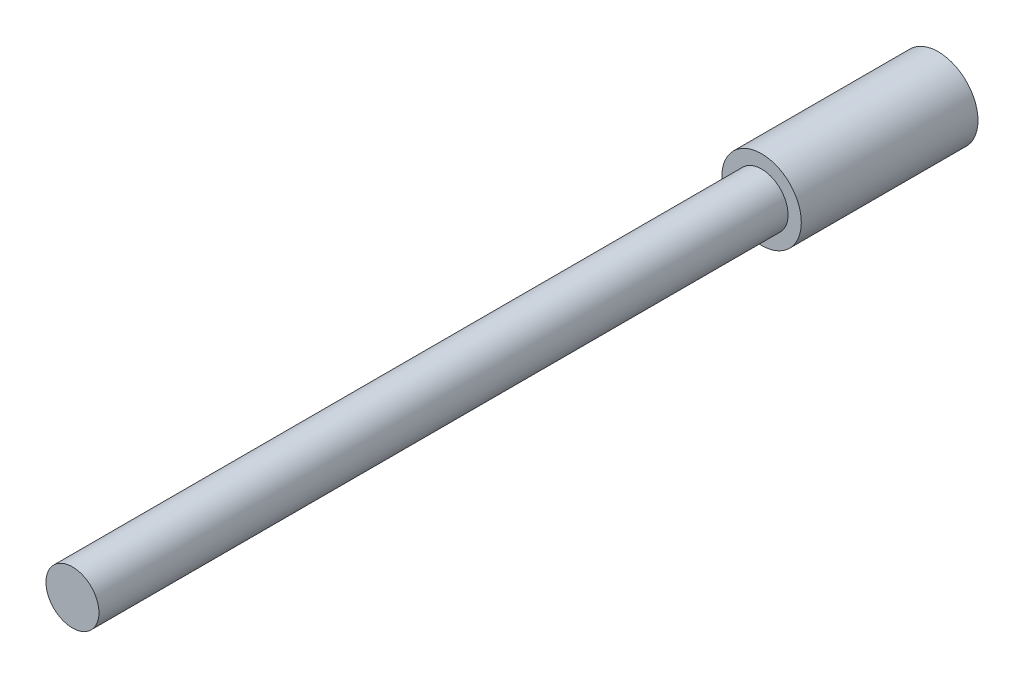
ISO-10303-21;
HEADER;
FILE_DESCRIPTION(('STEP AP214'),'2;1');
FILE_NAME('part.step','',(''),(''),'','','');
FILE_SCHEMA(('AUTOMOTIVE_DESIGN { 1 0 10303 214 1 1 1 1 }'));
ENDSEC;
DATA;
#1=APPLICATION_CONTEXT('core data for automotive mechanical design processes');
#2=APPLICATION_PROTOCOL_DEFINITION('international standard','automotive_design',2000,#1);
#3=PRODUCT_CONTEXT('',#1,'mechanical');
#4=PRODUCT('Part','Part','',(#3));
#5=PRODUCT_RELATED_PRODUCT_CATEGORY('part','',(#4));
#6=PRODUCT_DEFINITION_FORMATION('','',#4);
#7=PRODUCT_DEFINITION_CONTEXT('part definition',#1,'design');
#8=PRODUCT_DEFINITION('design','',#6,#7);
#9=PRODUCT_DEFINITION_SHAPE('','',#8);
#10=(LENGTH_UNIT() NAMED_UNIT(*) SI_UNIT(.MILLI.,.METRE.));
#11=(NAMED_UNIT(*) PLANE_ANGLE_UNIT() SI_UNIT($,.RADIAN.));
#12=(NAMED_UNIT(*) SI_UNIT($,.STERADIAN.) SOLID_ANGLE_UNIT());
#13=UNCERTAINTY_MEASURE_WITH_UNIT(LENGTH_MEASURE(1.E-05),#10,'distance_accuracy_value','');
#14=(GEOMETRIC_REPRESENTATION_CONTEXT(3) GLOBAL_UNCERTAINTY_ASSIGNED_CONTEXT((#13)) GLOBAL_UNIT_ASSIGNED_CONTEXT((#10,
#11,#12)) REPRESENTATION_CONTEXT('',''));
#15=CARTESIAN_POINT('',(0.,0.,0.));
#16=DIRECTION('',(0.,0.,1.));
#17=DIRECTION('',(1.,0.,0.));
#18=AXIS2_PLACEMENT_3D('',#15,#16,#17);
#19=CARTESIAN_POINT('',(0.,0.,10.));
#20=DIRECTION('',(0.,0.,1.));
#21=DIRECTION('',(1.,0.,0.));
#22=AXIS2_PLACEMENT_3D('',#19,#20,#21);
#23=PLANE('',#22);
#24=CARTESIAN_POINT('',(0.,0.,10.));
#25=DIRECTION('',(0.,0.,1.));
#26=DIRECTION('',(1.,0.,0.));
#27=AXIS2_PLACEMENT_3D('',#24,#25,#26);
#28=CIRCLE('',#27,2.25);
#29=CARTESIAN_POINT('',(2.25,0.,10.));
#30=VERTEX_POINT('',#29);
#31=EDGE_CURVE('E10',#30,#30,#28,.T.);
#32=ORIENTED_EDGE('',*,*,#31,.T.);
#33=EDGE_LOOP('',(#32));
#34=FACE_BOUND('',#33,.T.);
#35=CARTESIAN_POINT('',(0.,0.,10.));
#36=DIRECTION('',(0.,0.,1.));
#37=DIRECTION('',(1.,0.,0.));
#38=AXIS2_PLACEMENT_3D('',#35,#36,#37);
#39=CIRCLE('',#38,1.5);
#40=CARTESIAN_POINT('',(1.5,0.,10.));
#41=VERTEX_POINT('',#40);
#42=EDGE_CURVE('E46',#41,#41,#39,.T.);
#43=ORIENTED_EDGE('',*,*,#42,.F.);
#44=EDGE_LOOP('',(#43));
#45=FACE_BOUND('',#44,.T.);
#46=ADVANCED_FACE('F33',(#34,#45),#23,.T.);
#47=CARTESIAN_POINT('',(0.,0.,10.));
#48=DIRECTION('',(0.,0.,-1.));
#49=DIRECTION('',(-1.,0.,0.));
#50=AXIS2_PLACEMENT_3D('',#47,#48,#49);
#51=CYLINDRICAL_SURFACE('',#50,2.25);
#52=ORIENTED_EDGE('',*,*,#31,.F.);
#53=EDGE_LOOP('',(#52));
#54=FACE_BOUND('',#53,.T.);
#55=CARTESIAN_POINT('',(0.,0.,0.));
#56=DIRECTION('',(0.,0.,1.));
#57=DIRECTION('',(1.,0.,0.));
#58=AXIS2_PLACEMENT_3D('',#55,#56,#57);
#59=CIRCLE('',#58,2.25);
#60=CARTESIAN_POINT('',(2.25,0.,0.));
#61=VERTEX_POINT('',#60);
#62=EDGE_CURVE('E37',#61,#61,#59,.T.);
#63=ORIENTED_EDGE('',*,*,#62,.T.);
#64=EDGE_LOOP('',(#63));
#65=FACE_BOUND('',#64,.T.);
#66=ADVANCED_FACE('F35',(#54,#65),#51,.T.);
#67=CARTESIAN_POINT('',(0.,0.,0.));
#68=DIRECTION('',(0.,0.,1.));
#69=DIRECTION('',(1.,0.,0.));
#70=AXIS2_PLACEMENT_3D('',#67,#68,#69);
#71=PLANE('',#70);
#72=CARTESIAN_POINT('',(0.,0.,0.));
#73=DIRECTION('',(0.,0.,-1.));
#74=DIRECTION('',(-1.,0.,0.));
#75=AXIS2_PLACEMENT_3D('',#72,#73,#74);
#76=CIRCLE('',#75,1.5);
#77=CARTESIAN_POINT('',(-1.5,0.,0.));
#78=VERTEX_POINT('',#77);
#79=EDGE_CURVE('E52',#78,#78,#76,.T.);
#80=ORIENTED_EDGE('',*,*,#79,.F.);
#81=EDGE_LOOP('',(#80));
#82=FACE_BOUND('',#81,.T.);
#83=ORIENTED_EDGE('',*,*,#62,.F.);
#84=EDGE_LOOP('',(#83));
#85=FACE_BOUND('',#84,.T.);
#86=ADVANCED_FACE('F67',(#82,#85),#71,.F.);
#87=CARTESIAN_POINT('',(0.,0.,49.));
#88=DIRECTION('',(0.,0.,-1.));
#89=DIRECTION('',(-1.,0.,0.));
#90=AXIS2_PLACEMENT_3D('',#87,#88,#89);
#91=CYLINDRICAL_SURFACE('',#90,1.5);
#92=CARTESIAN_POINT('',(0.,0.,49.));
#93=DIRECTION('',(0.,0.,1.));
#94=DIRECTION('',(1.,0.,0.));
#95=AXIS2_PLACEMENT_3D('',#92,#93,#94);
#96=CIRCLE('',#95,1.5);
#97=CARTESIAN_POINT('',(1.5,0.,49.));
#98=VERTEX_POINT('',#97);
#99=EDGE_CURVE('E44',#98,#98,#96,.T.);
#100=ORIENTED_EDGE('',*,*,#99,.F.);
#101=EDGE_LOOP('',(#100));
#102=FACE_BOUND('',#101,.T.);
#103=ORIENTED_EDGE('',*,*,#42,.T.);
#104=EDGE_LOOP('',(#103));
#105=FACE_BOUND('',#104,.T.);
#106=ADVANCED_FACE('F70',(#102,#105),#91,.T.);
#107=CARTESIAN_POINT('',(0.,0.,49.));
#108=DIRECTION('',(0.,0.,1.));
#109=DIRECTION('',(1.,0.,0.));
#110=AXIS2_PLACEMENT_3D('',#107,#108,#109);
#111=PLANE('',#110);
#112=ORIENTED_EDGE('',*,*,#99,.T.);
#113=EDGE_LOOP('',(#112));
#114=FACE_BOUND('',#113,.T.);
#115=ADVANCED_FACE('F63',(#114),#111,.T.);
#116=CARTESIAN_POINT('',(0.,0.,4.5));
#117=DIRECTION('',(0.,0.,-1.));
#118=DIRECTION('',(-1.,0.,0.));
#119=AXIS2_PLACEMENT_3D('',#116,#117,#118);
#120=CYLINDRICAL_SURFACE('',#119,1.5);
#121=CARTESIAN_POINT('',(0.,0.,4.5));
#122=DIRECTION('',(0.,0.,-1.));
#123=DIRECTION('',(-1.,0.,0.));
#124=AXIS2_PLACEMENT_3D('',#121,#122,#123);
#125=CIRCLE('',#124,1.5);
#126=CARTESIAN_POINT('',(-1.5,0.,4.5));
#127=VERTEX_POINT('',#126);
#128=EDGE_CURVE('E49',#127,#127,#125,.T.);
#129=ORIENTED_EDGE('',*,*,#128,.F.);
#130=EDGE_LOOP('',(#129));
#131=FACE_BOUND('',#130,.T.);
#132=ORIENTED_EDGE('',*,*,#79,.T.);
#133=EDGE_LOOP('',(#132));
#134=FACE_BOUND('',#133,.T.);
#135=ADVANCED_FACE('F60',(#131,#134),#120,.F.);
#136=CARTESIAN_POINT('',(0.,0.,4.5));
#137=DIRECTION('',(0.,0.,-1.));
#138=DIRECTION('',(-1.,0.,0.));
#139=AXIS2_PLACEMENT_3D('',#136,#137,#138);
#140=PLANE('',#139);
#141=ORIENTED_EDGE('',*,*,#128,.T.);
#142=EDGE_LOOP('',(#141));
#143=FACE_BOUND('',#142,.T.);
#144=ADVANCED_FACE('F58',(#143),#140,.T.);
#145=CLOSED_SHELL('',(#46,#66,#86,#106,#115,#135,#144));
#146=MANIFOLD_SOLID_BREP('B2',#145);
#147=ADVANCED_BREP_SHAPE_REPRESENTATION('',(#18,#146),#14);
#148=SHAPE_DEFINITION_REPRESENTATION(#9,#147);
ENDSEC;
END-ISO-10303-21;
